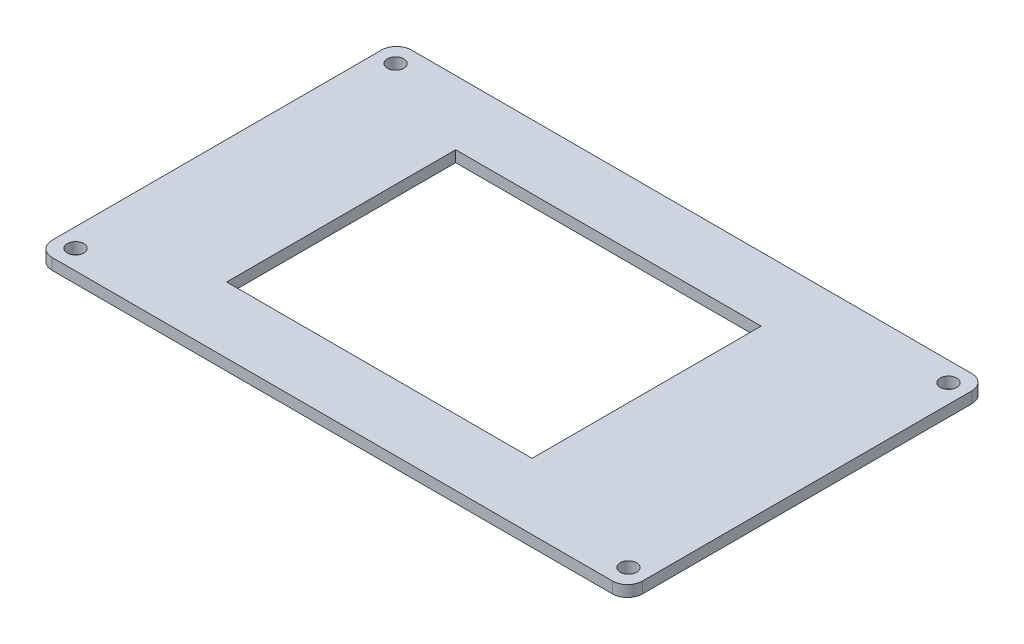
ISO-10303-21;
HEADER;
FILE_DESCRIPTION(('STEP AP214'),'2;1');
FILE_NAME('part.step','',(''),(''),'','','');
FILE_SCHEMA(('AUTOMOTIVE_DESIGN { 1 0 10303 214 1 1 1 1 }'));
ENDSEC;
DATA;
#1=APPLICATION_CONTEXT('core data for automotive mechanical design processes');
#2=APPLICATION_PROTOCOL_DEFINITION('international standard','automotive_design',2000,#1);
#3=PRODUCT_CONTEXT('',#1,'mechanical');
#4=PRODUCT('Part','Part','',(#3));
#5=PRODUCT_RELATED_PRODUCT_CATEGORY('part','',(#4));
#6=PRODUCT_DEFINITION_FORMATION('','',#4);
#7=PRODUCT_DEFINITION_CONTEXT('part definition',#1,'design');
#8=PRODUCT_DEFINITION('design','',#6,#7);
#9=PRODUCT_DEFINITION_SHAPE('','',#8);
#10=(LENGTH_UNIT() NAMED_UNIT(*) SI_UNIT(.MILLI.,.METRE.));
#11=(NAMED_UNIT(*) PLANE_ANGLE_UNIT() SI_UNIT($,.RADIAN.));
#12=(NAMED_UNIT(*) SI_UNIT($,.STERADIAN.) SOLID_ANGLE_UNIT());
#13=UNCERTAINTY_MEASURE_WITH_UNIT(LENGTH_MEASURE(1.E-05),#10,'distance_accuracy_value','');
#14=(GEOMETRIC_REPRESENTATION_CONTEXT(3) GLOBAL_UNCERTAINTY_ASSIGNED_CONTEXT((#13)) GLOBAL_UNIT_ASSIGNED_CONTEXT((#10,
#11,#12)) REPRESENTATION_CONTEXT('',''));
#15=CARTESIAN_POINT('',(0.,0.,0.));
#16=DIRECTION('',(0.,0.,1.));
#17=DIRECTION('',(1.,0.,0.));
#18=AXIS2_PLACEMENT_3D('',#15,#16,#17);
#19=CARTESIAN_POINT('',(0.,1.5,0.));
#20=DIRECTION('',(0.,1.,0.));
#21=DIRECTION('',(0.,0.,1.));
#22=AXIS2_PLACEMENT_3D('',#19,#20,#21);
#23=PLANE('',#22);
#24=CARTESIAN_POINT('',(-36.93,1.5,21.375));
#25=DIRECTION('',(0.,1.,0.));
#26=DIRECTION('',(0.,0.,1.));
#27=AXIS2_PLACEMENT_3D('',#24,#25,#26);
#28=CIRCLE('',#27,1.1);
#29=CARTESIAN_POINT('',(-36.93,1.5,22.475));
#30=VERTEX_POINT('',#29);
#31=EDGE_CURVE('E501',#30,#30,#28,.T.);
#32=ORIENTED_EDGE('',*,*,#31,.F.);
#33=EDGE_LOOP('',(#32));
#34=FACE_BOUND('',#33,.T.);
#35=CARTESIAN_POINT('',(36.93,1.5,-21.375));
#36=DIRECTION('',(0.,1.,0.));
#37=DIRECTION('',(0.,0.,1.));
#38=AXIS2_PLACEMENT_3D('',#35,#36,#37);
#39=CIRCLE('',#38,1.1);
#40=CARTESIAN_POINT('',(36.93,1.5,-20.275));
#41=VERTEX_POINT('',#40);
#42=EDGE_CURVE('E504',#41,#41,#39,.T.);
#43=ORIENTED_EDGE('',*,*,#42,.F.);
#44=EDGE_LOOP('',(#43));
#45=FACE_BOUND('',#44,.T.);
#46=CARTESIAN_POINT('',(36.93,1.5,21.375));
#47=DIRECTION('',(0.,1.,0.));
#48=DIRECTION('',(0.,0.,1.));
#49=AXIS2_PLACEMENT_3D('',#46,#47,#48);
#50=CIRCLE('',#49,1.1);
#51=CARTESIAN_POINT('',(36.93,1.5,22.475));
#52=VERTEX_POINT('',#51);
#53=EDGE_CURVE('E513',#52,#52,#50,.T.);
#54=ORIENTED_EDGE('',*,*,#53,.F.);
#55=EDGE_LOOP('',(#54));
#56=FACE_BOUND('',#55,.T.);
#57=CARTESIAN_POINT('',(-36.93,1.5,-21.375));
#58=DIRECTION('',(0.,1.,0.));
#59=DIRECTION('',(0.,0.,1.));
#60=AXIS2_PLACEMENT_3D('',#57,#58,#59);
#61=CIRCLE('',#60,1.1);
#62=CARTESIAN_POINT('',(-36.93,1.5,-20.275));
#63=VERTEX_POINT('',#62);
#64=EDGE_CURVE('E495',#63,#63,#61,.T.);
#65=ORIENTED_EDGE('',*,*,#64,.F.);
#66=EDGE_LOOP('',(#65));
#67=FACE_BOUND('',#66,.T.);
#68=DIRECTION('',(-1.,0.,0.));
#69=VECTOR('',#68,1.);
#70=CARTESIAN_POINT('',(39.43,1.5,-24.));
#71=LINE('',#70,#69);
#72=CARTESIAN_POINT('',(37.43,1.5,-24.));
#73=VERTEX_POINT('',#72);
#74=CARTESIAN_POINT('',(-37.43,1.5,-24.));
#75=VERTEX_POINT('',#74);
#76=EDGE_CURVE('E201',#73,#75,#71,.T.);
#77=ORIENTED_EDGE('',*,*,#76,.T.);
#78=CARTESIAN_POINT('',(-37.43,1.5,-22.));
#79=DIRECTION('',(0.,1.,0.));
#80=DIRECTION('',(0.,0.,1.));
#81=AXIS2_PLACEMENT_3D('',#78,#79,#80);
#82=CIRCLE('',#81,2.);
#83=CARTESIAN_POINT('',(-39.43,1.5,-22.));
#84=VERTEX_POINT('',#83);
#85=EDGE_CURVE('E252',#75,#84,#82,.T.);
#86=ORIENTED_EDGE('',*,*,#85,.T.);
#87=DIRECTION('',(0.,0.,1.));
#88=VECTOR('',#87,1.);
#89=CARTESIAN_POINT('',(-39.43,1.5,24.));
#90=LINE('',#89,#88);
#91=CARTESIAN_POINT('',(-39.43,1.5,22.));
#92=VERTEX_POINT('',#91);
#93=EDGE_CURVE('E190',#84,#92,#90,.T.);
#94=ORIENTED_EDGE('',*,*,#93,.T.);
#95=CARTESIAN_POINT('',(-37.43,1.5,22.));
#96=DIRECTION('',(0.,1.,0.));
#97=DIRECTION('',(0.,0.,1.));
#98=AXIS2_PLACEMENT_3D('',#95,#96,#97);
#99=CIRCLE('',#98,2.);
#100=CARTESIAN_POINT('',(-37.43,1.5,24.));
#101=VERTEX_POINT('',#100);
#102=EDGE_CURVE('E244',#92,#101,#99,.T.);
#103=ORIENTED_EDGE('',*,*,#102,.T.);
#104=DIRECTION('',(1.,0.,0.));
#105=VECTOR('',#104,1.);
#106=CARTESIAN_POINT('',(39.43,1.5,24.));
#107=LINE('',#106,#105);
#108=CARTESIAN_POINT('',(37.43,1.5,24.));
#109=VERTEX_POINT('',#108);
#110=EDGE_CURVE('E194',#101,#109,#107,.T.);
#111=ORIENTED_EDGE('',*,*,#110,.T.);
#112=CARTESIAN_POINT('',(37.43,1.5,22.));
#113=DIRECTION('',(0.,1.,0.));
#114=DIRECTION('',(0.,0.,1.));
#115=AXIS2_PLACEMENT_3D('',#112,#113,#114);
#116=CIRCLE('',#115,2.);
#117=CARTESIAN_POINT('',(39.43,1.5,22.));
#118=VERTEX_POINT('',#117);
#119=EDGE_CURVE('E66',#109,#118,#116,.T.);
#120=ORIENTED_EDGE('',*,*,#119,.T.);
#121=DIRECTION('',(0.,0.,-1.));
#122=VECTOR('',#121,1.);
#123=CARTESIAN_POINT('',(39.43,1.5,24.));
#124=LINE('',#123,#122);
#125=CARTESIAN_POINT('',(39.43,1.5,-22.));
#126=VERTEX_POINT('',#125);
#127=EDGE_CURVE('E198',#118,#126,#124,.T.);
#128=ORIENTED_EDGE('',*,*,#127,.T.);
#129=CARTESIAN_POINT('',(37.43,1.5,-22.));
#130=DIRECTION('',(0.,1.,0.));
#131=DIRECTION('',(0.,0.,1.));
#132=AXIS2_PLACEMENT_3D('',#129,#130,#131);
#133=CIRCLE('',#132,2.);
#134=EDGE_CURVE('E249',#126,#73,#133,.T.);
#135=ORIENTED_EDGE('',*,*,#134,.T.);
#136=EDGE_LOOP('',(#77,#86,#94,#103,#111,#120,#128,#135));
#137=FACE_BOUND('',#136,.T.);
#138=DIRECTION('',(1.,0.,0.));
#139=VECTOR('',#138,1.);
#140=CARTESIAN_POINT('',(-22.94,1.5,15.18));
#141=LINE('',#140,#139);
#142=CARTESIAN_POINT('',(-22.94,1.5,15.18));
#143=VERTEX_POINT('',#142);
#144=CARTESIAN_POINT('',(17.86,1.5,15.1799999999999));
#145=VERTEX_POINT('',#144);
#146=EDGE_CURVE('E146',#143,#145,#141,.T.);
#147=ORIENTED_EDGE('',*,*,#146,.F.);
#148=DIRECTION('',(0.,0.,1.));
#149=VECTOR('',#148,1.);
#150=CARTESIAN_POINT('',(-22.9400000000002,1.5,-15.42));
#151=LINE('',#150,#149);
#152=CARTESIAN_POINT('',(-22.9400000000002,1.5,-15.42));
#153=VERTEX_POINT('',#152);
#154=EDGE_CURVE('E135',#153,#143,#151,.T.);
#155=ORIENTED_EDGE('',*,*,#154,.F.);
#156=DIRECTION('',(-1.,0.,0.));
#157=VECTOR('',#156,1.);
#158=CARTESIAN_POINT('',(-22.9400000000002,1.5,-15.42));
#159=LINE('',#158,#157);
#160=CARTESIAN_POINT('',(17.86,1.5,-15.42));
#161=VERTEX_POINT('',#160);
#162=EDGE_CURVE('E164',#161,#153,#159,.T.);
#163=ORIENTED_EDGE('',*,*,#162,.F.);
#164=DIRECTION('',(0.,0.,-1.));
#165=VECTOR('',#164,1.);
#166=CARTESIAN_POINT('',(17.86,1.5,-15.42));
#167=LINE('',#166,#165);
#168=EDGE_CURVE('E160',#145,#161,#167,.T.);
#169=ORIENTED_EDGE('',*,*,#168,.F.);
#170=EDGE_LOOP('',(#147,#155,#163,#169));
#171=FACE_BOUND('',#170,.T.);
#172=ADVANCED_FACE('F43',(#34,#45,#56,#67,#137,#171),#23,.T.);
#173=CARTESIAN_POINT('',(0.,0.,0.));
#174=DIRECTION('',(0.,1.,0.));
#175=DIRECTION('',(0.,0.,1.));
#176=AXIS2_PLACEMENT_3D('',#173,#174,#175);
#177=PLANE('',#176);
#178=CARTESIAN_POINT('',(-36.93,0.,21.375));
#179=DIRECTION('',(0.,1.,0.));
#180=DIRECTION('',(0.,0.,1.));
#181=AXIS2_PLACEMENT_3D('',#178,#179,#180);
#182=CIRCLE('',#181,1.1);
#183=CARTESIAN_POINT('',(-36.93,0.,22.475));
#184=VERTEX_POINT('',#183);
#185=EDGE_CURVE('E508',#184,#184,#182,.F.);
#186=ORIENTED_EDGE('',*,*,#185,.F.);
#187=EDGE_LOOP('',(#186));
#188=FACE_BOUND('',#187,.T.);
#189=CARTESIAN_POINT('',(36.93,0.,-21.375));
#190=DIRECTION('',(0.,1.,0.));
#191=DIRECTION('',(0.,0.,1.));
#192=AXIS2_PLACEMENT_3D('',#189,#190,#191);
#193=CIRCLE('',#192,1.1);
#194=CARTESIAN_POINT('',(36.93,0.,-20.275));
#195=VERTEX_POINT('',#194);
#196=EDGE_CURVE('E509',#195,#195,#193,.F.);
#197=ORIENTED_EDGE('',*,*,#196,.F.);
#198=EDGE_LOOP('',(#197));
#199=FACE_BOUND('',#198,.T.);
#200=CARTESIAN_POINT('',(36.93,0.,21.375));
#201=DIRECTION('',(0.,1.,0.));
#202=DIRECTION('',(0.,0.,1.));
#203=AXIS2_PLACEMENT_3D('',#200,#201,#202);
#204=CIRCLE('',#203,1.1);
#205=CARTESIAN_POINT('',(36.93,0.,22.475));
#206=VERTEX_POINT('',#205);
#207=EDGE_CURVE('E523',#206,#206,#204,.F.);
#208=ORIENTED_EDGE('',*,*,#207,.F.);
#209=EDGE_LOOP('',(#208));
#210=FACE_BOUND('',#209,.T.);
#211=CARTESIAN_POINT('',(-36.93,0.,-21.375));
#212=DIRECTION('',(0.,1.,0.));
#213=DIRECTION('',(0.,0.,1.));
#214=AXIS2_PLACEMENT_3D('',#211,#212,#213);
#215=CIRCLE('',#214,1.1);
#216=CARTESIAN_POINT('',(-36.93,0.,-20.275));
#217=VERTEX_POINT('',#216);
#218=EDGE_CURVE('E173',#217,#217,#215,.F.);
#219=ORIENTED_EDGE('',*,*,#218,.F.);
#220=EDGE_LOOP('',(#219));
#221=FACE_BOUND('',#220,.T.);
#222=DIRECTION('',(0.,0.,1.));
#223=VECTOR('',#222,1.);
#224=CARTESIAN_POINT('',(-39.43,0.,24.));
#225=LINE('',#224,#223);
#226=CARTESIAN_POINT('',(-39.43,0.,-22.));
#227=VERTEX_POINT('',#226);
#228=CARTESIAN_POINT('',(-39.43,0.,22.));
#229=VERTEX_POINT('',#228);
#230=EDGE_CURVE('E155',#227,#229,#225,.T.);
#231=ORIENTED_EDGE('',*,*,#230,.F.);
#232=CARTESIAN_POINT('',(-37.43,0.,-22.));
#233=DIRECTION('',(0.,1.,0.));
#234=DIRECTION('',(0.,0.,1.));
#235=AXIS2_PLACEMENT_3D('',#232,#233,#234);
#236=CIRCLE('',#235,2.);
#237=CARTESIAN_POINT('',(-37.43,0.,-24.));
#238=VERTEX_POINT('',#237);
#239=EDGE_CURVE('E234',#227,#238,#236,.F.);
#240=ORIENTED_EDGE('',*,*,#239,.T.);
#241=DIRECTION('',(-1.,0.,0.));
#242=VECTOR('',#241,1.);
#243=CARTESIAN_POINT('',(39.43,0.,-24.));
#244=LINE('',#243,#242);
#245=CARTESIAN_POINT('',(37.43,0.,-24.));
#246=VERTEX_POINT('',#245);
#247=EDGE_CURVE('E195',#246,#238,#244,.T.);
#248=ORIENTED_EDGE('',*,*,#247,.F.);
#249=CARTESIAN_POINT('',(37.43,0.,-22.));
#250=DIRECTION('',(0.,1.,0.));
#251=DIRECTION('',(0.,0.,1.));
#252=AXIS2_PLACEMENT_3D('',#249,#250,#251);
#253=CIRCLE('',#252,2.);
#254=CARTESIAN_POINT('',(39.43,0.,-22.));
#255=VERTEX_POINT('',#254);
#256=EDGE_CURVE('E231',#246,#255,#253,.F.);
#257=ORIENTED_EDGE('',*,*,#256,.T.);
#258=DIRECTION('',(0.,0.,-1.));
#259=VECTOR('',#258,1.);
#260=CARTESIAN_POINT('',(39.43,0.,24.));
#261=LINE('',#260,#259);
#262=CARTESIAN_POINT('',(39.43,0.,22.));
#263=VERTEX_POINT('',#262);
#264=EDGE_CURVE('E213',#263,#255,#261,.T.);
#265=ORIENTED_EDGE('',*,*,#264,.F.);
#266=CARTESIAN_POINT('',(37.43,0.,22.));
#267=DIRECTION('',(0.,1.,0.));
#268=DIRECTION('',(0.,0.,1.));
#269=AXIS2_PLACEMENT_3D('',#266,#267,#268);
#270=CIRCLE('',#269,2.);
#271=CARTESIAN_POINT('',(37.43,0.,24.));
#272=VERTEX_POINT('',#271);
#273=EDGE_CURVE('E228',#263,#272,#270,.F.);
#274=ORIENTED_EDGE('',*,*,#273,.T.);
#275=DIRECTION('',(1.,0.,0.));
#276=VECTOR('',#275,1.);
#277=CARTESIAN_POINT('',(39.43,0.,24.));
#278=LINE('',#277,#276);
#279=CARTESIAN_POINT('',(-37.43,0.,24.));
#280=VERTEX_POINT('',#279);
#281=EDGE_CURVE('E209',#280,#272,#278,.T.);
#282=ORIENTED_EDGE('',*,*,#281,.F.);
#283=CARTESIAN_POINT('',(-37.43,0.,22.));
#284=DIRECTION('',(0.,1.,0.));
#285=DIRECTION('',(0.,0.,1.));
#286=AXIS2_PLACEMENT_3D('',#283,#284,#285);
#287=CIRCLE('',#286,2.);
#288=EDGE_CURVE('E225',#280,#229,#287,.F.);
#289=ORIENTED_EDGE('',*,*,#288,.T.);
#290=EDGE_LOOP('',(#231,#240,#248,#257,#265,#274,#282,#289));
#291=FACE_BOUND('',#290,.T.);
#292=DIRECTION('',(0.,0.,1.));
#293=VECTOR('',#292,1.);
#294=CARTESIAN_POINT('',(-22.9400000000002,0.,-15.42));
#295=LINE('',#294,#293);
#296=CARTESIAN_POINT('',(-22.9400000000002,0.,-15.42));
#297=VERTEX_POINT('',#296);
#298=CARTESIAN_POINT('',(-22.94,0.,15.18));
#299=VERTEX_POINT('',#298);
#300=EDGE_CURVE('E170',#297,#299,#295,.T.);
#301=ORIENTED_EDGE('',*,*,#300,.T.);
#302=DIRECTION('',(1.,0.,0.));
#303=VECTOR('',#302,1.);
#304=CARTESIAN_POINT('',(-22.94,0.,15.18));
#305=LINE('',#304,#303);
#306=CARTESIAN_POINT('',(17.86,0.,15.1799999999999));
#307=VERTEX_POINT('',#306);
#308=EDGE_CURVE('E153',#299,#307,#305,.T.);
#309=ORIENTED_EDGE('',*,*,#308,.T.);
#310=DIRECTION('',(0.,0.,-1.));
#311=VECTOR('',#310,1.);
#312=CARTESIAN_POINT('',(17.86,0.,-15.42));
#313=LINE('',#312,#311);
#314=CARTESIAN_POINT('',(17.86,0.,-15.42));
#315=VERTEX_POINT('',#314);
#316=EDGE_CURVE('E176',#307,#315,#313,.T.);
#317=ORIENTED_EDGE('',*,*,#316,.T.);
#318=DIRECTION('',(-1.,0.,0.));
#319=VECTOR('',#318,1.);
#320=CARTESIAN_POINT('',(-22.9400000000002,0.,-15.42));
#321=LINE('',#320,#319);
#322=EDGE_CURVE('E147',#315,#297,#321,.T.);
#323=ORIENTED_EDGE('',*,*,#322,.T.);
#324=EDGE_LOOP('',(#301,#309,#317,#323));
#325=FACE_BOUND('',#324,.T.);
#326=ADVANCED_FACE('F272',(#188,#199,#210,#221,#291,#325),#177,.F.);
#327=CARTESIAN_POINT('',(-39.43,1.5,24.));
#328=DIRECTION('',(1.,0.,0.));
#329=DIRECTION('',(0.,0.,-1.));
#330=AXIS2_PLACEMENT_3D('',#327,#328,#329);
#331=PLANE('',#330);
#332=ORIENTED_EDGE('',*,*,#93,.F.);
#333=DIRECTION('',(0.,-1.,0.));
#334=VECTOR('',#333,1.);
#335=CARTESIAN_POINT('',(-39.43,1.5,-22.));
#336=LINE('',#335,#334);
#337=EDGE_CURVE('E221',#84,#227,#336,.T.);
#338=ORIENTED_EDGE('',*,*,#337,.T.);
#339=ORIENTED_EDGE('',*,*,#230,.T.);
#340=DIRECTION('',(0.,-1.,0.));
#341=VECTOR('',#340,1.);
#342=CARTESIAN_POINT('',(-39.43,1.5,22.));
#343=LINE('',#342,#341);
#344=EDGE_CURVE('E205',#229,#92,#343,.F.);
#345=ORIENTED_EDGE('',*,*,#344,.T.);
#346=EDGE_LOOP('',(#332,#338,#339,#345));
#347=FACE_BOUND('',#346,.T.);
#348=ADVANCED_FACE('F294',(#347),#331,.F.);
#349=CARTESIAN_POINT('',(39.43,1.5,24.));
#350=DIRECTION('',(0.,0.,-1.));
#351=DIRECTION('',(-1.,0.,0.));
#352=AXIS2_PLACEMENT_3D('',#349,#350,#351);
#353=PLANE('',#352);
#354=ORIENTED_EDGE('',*,*,#281,.T.);
#355=DIRECTION('',(0.,-1.,0.));
#356=VECTOR('',#355,1.);
#357=CARTESIAN_POINT('',(37.43,1.5,24.));
#358=LINE('',#357,#356);
#359=EDGE_CURVE('E11',#272,#109,#358,.F.);
#360=ORIENTED_EDGE('',*,*,#359,.T.);
#361=ORIENTED_EDGE('',*,*,#110,.F.);
#362=DIRECTION('',(0.,-1.,0.));
#363=VECTOR('',#362,1.);
#364=CARTESIAN_POINT('',(-37.43,1.5,24.));
#365=LINE('',#364,#363);
#366=EDGE_CURVE('E52',#101,#280,#365,.T.);
#367=ORIENTED_EDGE('',*,*,#366,.T.);
#368=EDGE_LOOP('',(#354,#360,#361,#367));
#369=FACE_BOUND('',#368,.T.);
#370=ADVANCED_FACE('F266',(#369),#353,.F.);
#371=CARTESIAN_POINT('',(39.43,1.5,24.));
#372=DIRECTION('',(-1.,0.,0.));
#373=DIRECTION('',(0.,0.,1.));
#374=AXIS2_PLACEMENT_3D('',#371,#372,#373);
#375=PLANE('',#374);
#376=ORIENTED_EDGE('',*,*,#264,.T.);
#377=DIRECTION('',(0.,-1.,0.));
#378=VECTOR('',#377,1.);
#379=CARTESIAN_POINT('',(39.43,1.5,-22.));
#380=LINE('',#379,#378);
#381=EDGE_CURVE('E59',#255,#126,#380,.F.);
#382=ORIENTED_EDGE('',*,*,#381,.T.);
#383=ORIENTED_EDGE('',*,*,#127,.F.);
#384=DIRECTION('',(0.,-1.,0.));
#385=VECTOR('',#384,1.);
#386=CARTESIAN_POINT('',(39.43,1.5,22.));
#387=LINE('',#386,#385);
#388=EDGE_CURVE('E255',#118,#263,#387,.T.);
#389=ORIENTED_EDGE('',*,*,#388,.T.);
#390=EDGE_LOOP('',(#376,#382,#383,#389));
#391=FACE_BOUND('',#390,.T.);
#392=ADVANCED_FACE('F278',(#391),#375,.F.);
#393=CARTESIAN_POINT('',(39.43,1.5,-24.));
#394=DIRECTION('',(0.,0.,1.));
#395=DIRECTION('',(1.,0.,0.));
#396=AXIS2_PLACEMENT_3D('',#393,#394,#395);
#397=PLANE('',#396);
#398=ORIENTED_EDGE('',*,*,#247,.T.);
#399=DIRECTION('',(0.,-1.,0.));
#400=VECTOR('',#399,1.);
#401=CARTESIAN_POINT('',(-37.43,1.5,-24.));
#402=LINE('',#401,#400);
#403=EDGE_CURVE('E241',#238,#75,#402,.F.);
#404=ORIENTED_EDGE('',*,*,#403,.T.);
#405=ORIENTED_EDGE('',*,*,#76,.F.);
#406=DIRECTION('',(0.,-1.,0.));
#407=VECTOR('',#406,1.);
#408=CARTESIAN_POINT('',(37.43,1.5,-24.));
#409=LINE('',#408,#407);
#410=EDGE_CURVE('E237',#73,#246,#409,.T.);
#411=ORIENTED_EDGE('',*,*,#410,.T.);
#412=EDGE_LOOP('',(#398,#404,#405,#411));
#413=FACE_BOUND('',#412,.T.);
#414=ADVANCED_FACE('F286',(#413),#397,.F.);
#415=CARTESIAN_POINT('',(-22.9400000000002,1.5,-15.42));
#416=DIRECTION('',(1.,0.,0.));
#417=DIRECTION('',(0.,0.,-1.));
#418=AXIS2_PLACEMENT_3D('',#415,#416,#417);
#419=PLANE('',#418);
#420=ORIENTED_EDGE('',*,*,#300,.F.);
#421=DIRECTION('',(0.,-1.,0.));
#422=VECTOR('',#421,1.);
#423=CARTESIAN_POINT('',(-22.9400000000002,1.5,-15.42));
#424=LINE('',#423,#422);
#425=EDGE_CURVE('E141',#153,#297,#424,.T.);
#426=ORIENTED_EDGE('',*,*,#425,.F.);
#427=ORIENTED_EDGE('',*,*,#154,.T.);
#428=DIRECTION('',(0.,-1.,0.));
#429=VECTOR('',#428,1.);
#430=CARTESIAN_POINT('',(-22.94,1.5,15.18));
#431=LINE('',#430,#429);
#432=EDGE_CURVE('E138',#143,#299,#431,.T.);
#433=ORIENTED_EDGE('',*,*,#432,.T.);
#434=EDGE_LOOP('',(#420,#426,#427,#433));
#435=FACE_BOUND('',#434,.T.);
#436=ADVANCED_FACE('F137',(#435),#419,.T.);
#437=CARTESIAN_POINT('',(-22.94,1.5,15.18));
#438=DIRECTION('',(0.,0.,-1.));
#439=DIRECTION('',(-1.,0.,0.));
#440=AXIS2_PLACEMENT_3D('',#437,#438,#439);
#441=PLANE('',#440);
#442=ORIENTED_EDGE('',*,*,#308,.F.);
#443=ORIENTED_EDGE('',*,*,#432,.F.);
#444=ORIENTED_EDGE('',*,*,#146,.T.);
#445=DIRECTION('',(0.,-1.,0.));
#446=VECTOR('',#445,1.);
#447=CARTESIAN_POINT('',(17.86,1.5,15.1799999999999));
#448=LINE('',#447,#446);
#449=EDGE_CURVE('E156',#145,#307,#448,.T.);
#450=ORIENTED_EDGE('',*,*,#449,.T.);
#451=EDGE_LOOP('',(#442,#443,#444,#450));
#452=FACE_BOUND('',#451,.T.);
#453=ADVANCED_FACE('F150',(#452),#441,.T.);
#454=CARTESIAN_POINT('',(17.86,1.5,-15.42));
#455=DIRECTION('',(-1.,0.,0.));
#456=DIRECTION('',(0.,0.,1.));
#457=AXIS2_PLACEMENT_3D('',#454,#455,#456);
#458=PLANE('',#457);
#459=ORIENTED_EDGE('',*,*,#316,.F.);
#460=ORIENTED_EDGE('',*,*,#449,.F.);
#461=ORIENTED_EDGE('',*,*,#168,.T.);
#462=DIRECTION('',(0.,-1.,0.));
#463=VECTOR('',#462,1.);
#464=CARTESIAN_POINT('',(17.86,1.5,-15.42));
#465=LINE('',#464,#463);
#466=EDGE_CURVE('E185',#161,#315,#465,.T.);
#467=ORIENTED_EDGE('',*,*,#466,.T.);
#468=EDGE_LOOP('',(#459,#460,#461,#467));
#469=FACE_BOUND('',#468,.T.);
#470=ADVANCED_FACE('F399',(#469),#458,.T.);
#471=CARTESIAN_POINT('',(-22.9400000000002,1.5,-15.42));
#472=DIRECTION('',(0.,0.,1.));
#473=DIRECTION('',(1.,0.,0.));
#474=AXIS2_PLACEMENT_3D('',#471,#472,#473);
#475=PLANE('',#474);
#476=ORIENTED_EDGE('',*,*,#322,.F.);
#477=ORIENTED_EDGE('',*,*,#466,.F.);
#478=ORIENTED_EDGE('',*,*,#162,.T.);
#479=ORIENTED_EDGE('',*,*,#425,.T.);
#480=EDGE_LOOP('',(#476,#477,#478,#479));
#481=FACE_BOUND('',#480,.T.);
#482=ADVANCED_FACE('F389',(#481),#475,.T.);
#483=CARTESIAN_POINT('',(-36.93,-0.000999999999999916,-21.375));
#484=DIRECTION('',(0.,1.,0.));
#485=DIRECTION('',(0.,0.,1.));
#486=AXIS2_PLACEMENT_3D('',#483,#484,#485);
#487=CYLINDRICAL_SURFACE('',#486,1.1);
#488=ORIENTED_EDGE('',*,*,#64,.T.);
#489=EDGE_LOOP('',(#488));
#490=FACE_BOUND('',#489,.T.);
#491=ORIENTED_EDGE('',*,*,#218,.T.);
#492=EDGE_LOOP('',(#491));
#493=FACE_BOUND('',#492,.T.);
#494=ADVANCED_FACE('F379',(#490,#493),#487,.F.);
#495=CARTESIAN_POINT('',(36.93,-0.000999999999999916,21.375));
#496=DIRECTION('',(0.,1.,0.));
#497=DIRECTION('',(0.,0.,1.));
#498=AXIS2_PLACEMENT_3D('',#495,#496,#497);
#499=CYLINDRICAL_SURFACE('',#498,1.1);
#500=ORIENTED_EDGE('',*,*,#53,.T.);
#501=EDGE_LOOP('',(#500));
#502=FACE_BOUND('',#501,.T.);
#503=ORIENTED_EDGE('',*,*,#207,.T.);
#504=EDGE_LOOP('',(#503));
#505=FACE_BOUND('',#504,.T.);
#506=ADVANCED_FACE('F369',(#502,#505),#499,.F.);
#507=CARTESIAN_POINT('',(36.93,-0.000999999999999916,-21.375));
#508=DIRECTION('',(0.,1.,0.));
#509=DIRECTION('',(0.,0.,1.));
#510=AXIS2_PLACEMENT_3D('',#507,#508,#509);
#511=CYLINDRICAL_SURFACE('',#510,1.1);
#512=ORIENTED_EDGE('',*,*,#42,.T.);
#513=EDGE_LOOP('',(#512));
#514=FACE_BOUND('',#513,.T.);
#515=ORIENTED_EDGE('',*,*,#196,.T.);
#516=EDGE_LOOP('',(#515));
#517=FACE_BOUND('',#516,.T.);
#518=ADVANCED_FACE('F359',(#514,#517),#511,.F.);
#519=CARTESIAN_POINT('',(-36.93,-0.000999999999999916,21.375));
#520=DIRECTION('',(0.,1.,0.));
#521=DIRECTION('',(0.,0.,1.));
#522=AXIS2_PLACEMENT_3D('',#519,#520,#521);
#523=CYLINDRICAL_SURFACE('',#522,1.1);
#524=ORIENTED_EDGE('',*,*,#31,.T.);
#525=EDGE_LOOP('',(#524));
#526=FACE_BOUND('',#525,.T.);
#527=ORIENTED_EDGE('',*,*,#185,.T.);
#528=EDGE_LOOP('',(#527));
#529=FACE_BOUND('',#528,.T.);
#530=ADVANCED_FACE('F323',(#526,#529),#523,.F.);
#531=CARTESIAN_POINT('',(-37.43,1.5,-22.));
#532=DIRECTION('',(0.,-1.,0.));
#533=DIRECTION('',(0.,0.,-1.));
#534=AXIS2_PLACEMENT_3D('',#531,#532,#533);
#535=CYLINDRICAL_SURFACE('',#534,2.);
#536=ORIENTED_EDGE('',*,*,#85,.F.);
#537=ORIENTED_EDGE('',*,*,#403,.F.);
#538=ORIENTED_EDGE('',*,*,#239,.F.);
#539=ORIENTED_EDGE('',*,*,#337,.F.);
#540=EDGE_LOOP('',(#536,#537,#538,#539));
#541=FACE_BOUND('',#540,.T.);
#542=ADVANCED_FACE('F291',(#541),#535,.T.);
#543=CARTESIAN_POINT('',(37.43,1.5,-22.));
#544=DIRECTION('',(0.,-1.,0.));
#545=DIRECTION('',(0.,0.,-1.));
#546=AXIS2_PLACEMENT_3D('',#543,#544,#545);
#547=CYLINDRICAL_SURFACE('',#546,2.);
#548=ORIENTED_EDGE('',*,*,#134,.F.);
#549=ORIENTED_EDGE('',*,*,#381,.F.);
#550=ORIENTED_EDGE('',*,*,#256,.F.);
#551=ORIENTED_EDGE('',*,*,#410,.F.);
#552=EDGE_LOOP('',(#548,#549,#550,#551));
#553=FACE_BOUND('',#552,.T.);
#554=ADVANCED_FACE('F283',(#553),#547,.T.);
#555=CARTESIAN_POINT('',(37.43,1.5,22.));
#556=DIRECTION('',(0.,-1.,0.));
#557=DIRECTION('',(0.,0.,-1.));
#558=AXIS2_PLACEMENT_3D('',#555,#556,#557);
#559=CYLINDRICAL_SURFACE('',#558,2.);
#560=ORIENTED_EDGE('',*,*,#119,.F.);
#561=ORIENTED_EDGE('',*,*,#359,.F.);
#562=ORIENTED_EDGE('',*,*,#273,.F.);
#563=ORIENTED_EDGE('',*,*,#388,.F.);
#564=EDGE_LOOP('',(#560,#561,#562,#563));
#565=FACE_BOUND('',#564,.T.);
#566=ADVANCED_FACE('F277',(#565),#559,.T.);
#567=CARTESIAN_POINT('',(-37.43,1.5,22.));
#568=DIRECTION('',(0.,-1.,0.));
#569=DIRECTION('',(0.,0.,-1.));
#570=AXIS2_PLACEMENT_3D('',#567,#568,#569);
#571=CYLINDRICAL_SURFACE('',#570,2.);
#572=ORIENTED_EDGE('',*,*,#102,.F.);
#573=ORIENTED_EDGE('',*,*,#344,.F.);
#574=ORIENTED_EDGE('',*,*,#288,.F.);
#575=ORIENTED_EDGE('',*,*,#366,.F.);
#576=EDGE_LOOP('',(#572,#573,#574,#575));
#577=FACE_BOUND('',#576,.T.);
#578=ADVANCED_FACE('F45',(#577),#571,.T.);
#579=CLOSED_SHELL('',(#172,#326,#348,#370,#392,#414,#436,#453,#470,#482,#494,#506,#518,#530,
#542,#554,#566,#578));
#580=MANIFOLD_SOLID_BREP('B2',#579);
#581=ADVANCED_BREP_SHAPE_REPRESENTATION('',(#18,#580),#14);
#582=SHAPE_DEFINITION_REPRESENTATION(#9,#581);
ENDSEC;
END-ISO-10303-21;
